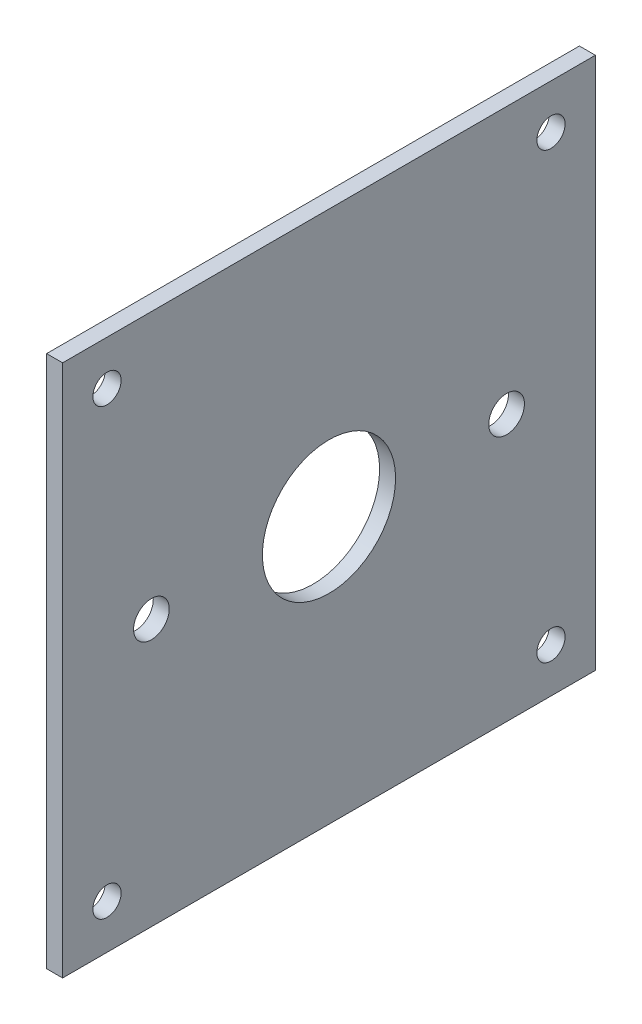
ISO-10303-21;
HEADER;
FILE_DESCRIPTION(('STEP AP214'),'2;1');
FILE_NAME('part.step','',(''),(''),'','','');
FILE_SCHEMA(('AUTOMOTIVE_DESIGN { 1 0 10303 214 1 1 1 1 }'));
ENDSEC;
DATA;
#1=APPLICATION_CONTEXT('core data for automotive mechanical design processes');
#2=APPLICATION_PROTOCOL_DEFINITION('international standard','automotive_design',2000,#1);
#3=PRODUCT_CONTEXT('',#1,'mechanical');
#4=PRODUCT('Part','Part','',(#3));
#5=PRODUCT_RELATED_PRODUCT_CATEGORY('part','',(#4));
#6=PRODUCT_DEFINITION_FORMATION('','',#4);
#7=PRODUCT_DEFINITION_CONTEXT('part definition',#1,'design');
#8=PRODUCT_DEFINITION('design','',#6,#7);
#9=PRODUCT_DEFINITION_SHAPE('','',#8);
#10=(LENGTH_UNIT() NAMED_UNIT(*) SI_UNIT(.MILLI.,.METRE.));
#11=(NAMED_UNIT(*) PLANE_ANGLE_UNIT() SI_UNIT($,.RADIAN.));
#12=(NAMED_UNIT(*) SI_UNIT($,.STERADIAN.) SOLID_ANGLE_UNIT());
#13=UNCERTAINTY_MEASURE_WITH_UNIT(LENGTH_MEASURE(1.E-05),#10,'distance_accuracy_value','');
#14=(GEOMETRIC_REPRESENTATION_CONTEXT(3) GLOBAL_UNCERTAINTY_ASSIGNED_CONTEXT((#13)) GLOBAL_UNIT_ASSIGNED_CONTEXT((#10,
#11,#12)) REPRESENTATION_CONTEXT('',''));
#15=CARTESIAN_POINT('',(0.,0.,0.));
#16=DIRECTION('',(0.,0.,1.));
#17=DIRECTION('',(1.,0.,0.));
#18=AXIS2_PLACEMENT_3D('',#15,#16,#17);
#19=CARTESIAN_POINT('',(2.286,0.,0.));
#20=DIRECTION('',(-1.,0.,0.));
#21=DIRECTION('',(0.,0.,1.));
#22=AXIS2_PLACEMENT_3D('',#19,#20,#21);
#23=PLANE('',#22);
#24=DIRECTION('',(0.,0.,1.));
#25=VECTOR('',#24,1.);
#26=CARTESIAN_POINT('',(2.286,38.1,38.1));
#27=LINE('',#26,#25);
#28=CARTESIAN_POINT('',(2.286,38.1,-38.1));
#29=VERTEX_POINT('',#28);
#30=CARTESIAN_POINT('',(2.286,38.1,38.1));
#31=VERTEX_POINT('',#30);
#32=EDGE_CURVE('E89',#29,#31,#27,.T.);
#33=ORIENTED_EDGE('',*,*,#32,.T.);
#34=DIRECTION('',(0.,-1.,0.));
#35=VECTOR('',#34,1.);
#36=CARTESIAN_POINT('',(2.286,-38.1,38.1));
#37=LINE('',#36,#35);
#38=CARTESIAN_POINT('',(2.286,-38.1,38.1));
#39=VERTEX_POINT('',#38);
#40=EDGE_CURVE('E84',#31,#39,#37,.T.);
#41=ORIENTED_EDGE('',*,*,#40,.T.);
#42=DIRECTION('',(0.,0.,-1.));
#43=VECTOR('',#42,1.);
#44=CARTESIAN_POINT('',(2.286,-38.1,-38.1));
#45=LINE('',#44,#43);
#46=CARTESIAN_POINT('',(2.286,-38.1,-38.1));
#47=VERTEX_POINT('',#46);
#48=EDGE_CURVE('E87',#39,#47,#45,.T.);
#49=ORIENTED_EDGE('',*,*,#48,.T.);
#50=DIRECTION('',(0.,1.,0.));
#51=VECTOR('',#50,1.);
#52=CARTESIAN_POINT('',(2.286,38.1,-38.1));
#53=LINE('',#52,#51);
#54=EDGE_CURVE('E54',#47,#29,#53,.T.);
#55=ORIENTED_EDGE('',*,*,#54,.T.);
#56=EDGE_LOOP('',(#33,#41,#49,#55));
#57=FACE_BOUND('',#56,.T.);
#58=CARTESIAN_POINT('',(2.286,0.,25.4));
#59=DIRECTION('',(1.,0.,0.));
#60=DIRECTION('',(0.,0.,-1.));
#61=AXIS2_PLACEMENT_3D('',#58,#59,#60);
#62=CIRCLE('',#61,2.5527);
#63=CARTESIAN_POINT('',(2.286,0.,22.8473));
#64=VERTEX_POINT('',#63);
#65=EDGE_CURVE('E104',#64,#64,#62,.T.);
#66=ORIENTED_EDGE('',*,*,#65,.F.);
#67=EDGE_LOOP('',(#66));
#68=FACE_BOUND('',#67,.T.);
#69=CARTESIAN_POINT('',(2.286,31.75,31.75));
#70=DIRECTION('',(1.,0.,0.));
#71=DIRECTION('',(0.,0.,-1.));
#72=AXIS2_PLACEMENT_3D('',#69,#70,#71);
#73=CIRCLE('',#72,2.0193);
#74=CARTESIAN_POINT('',(2.286,31.75,29.7307));
#75=VERTEX_POINT('',#74);
#76=EDGE_CURVE('E119',#75,#75,#73,.T.);
#77=ORIENTED_EDGE('',*,*,#76,.F.);
#78=EDGE_LOOP('',(#77));
#79=FACE_BOUND('',#78,.T.);
#80=CARTESIAN_POINT('',(2.286,0.,0.));
#81=DIRECTION('',(1.,0.,0.));
#82=DIRECTION('',(0.,0.,-1.));
#83=AXIS2_PLACEMENT_3D('',#80,#81,#82);
#84=CIRCLE('',#83,9.525);
#85=CARTESIAN_POINT('',(2.286,0.,-9.525));
#86=VERTEX_POINT('',#85);
#87=EDGE_CURVE('E125',#86,#86,#84,.T.);
#88=ORIENTED_EDGE('',*,*,#87,.F.);
#89=EDGE_LOOP('',(#88));
#90=FACE_BOUND('',#89,.T.);
#91=CARTESIAN_POINT('',(2.286,0.,-25.4));
#92=DIRECTION('',(1.,0.,0.));
#93=DIRECTION('',(0.,0.,-1.));
#94=AXIS2_PLACEMENT_3D('',#91,#92,#93);
#95=CIRCLE('',#94,2.5527);
#96=CARTESIAN_POINT('',(2.286,0.,-27.9527));
#97=VERTEX_POINT('',#96);
#98=EDGE_CURVE('E131',#97,#97,#95,.T.);
#99=ORIENTED_EDGE('',*,*,#98,.F.);
#100=EDGE_LOOP('',(#99));
#101=FACE_BOUND('',#100,.T.);
#102=CARTESIAN_POINT('',(2.286,31.75,-31.75));
#103=DIRECTION('',(1.,0.,0.));
#104=DIRECTION('',(0.,0.,-1.));
#105=AXIS2_PLACEMENT_3D('',#102,#103,#104);
#106=CIRCLE('',#105,2.0193);
#107=CARTESIAN_POINT('',(2.286,31.75,-33.7693));
#108=VERTEX_POINT('',#107);
#109=EDGE_CURVE('E137',#108,#108,#106,.T.);
#110=ORIENTED_EDGE('',*,*,#109,.F.);
#111=EDGE_LOOP('',(#110));
#112=FACE_BOUND('',#111,.T.);
#113=CARTESIAN_POINT('',(2.286,-31.75,-31.75));
#114=DIRECTION('',(1.,0.,0.));
#115=DIRECTION('',(0.,0.,-1.));
#116=AXIS2_PLACEMENT_3D('',#113,#114,#115);
#117=CIRCLE('',#116,2.0193);
#118=CARTESIAN_POINT('',(2.286,-31.75,-33.7693));
#119=VERTEX_POINT('',#118);
#120=EDGE_CURVE('E143',#119,#119,#117,.T.);
#121=ORIENTED_EDGE('',*,*,#120,.F.);
#122=EDGE_LOOP('',(#121));
#123=FACE_BOUND('',#122,.T.);
#124=CARTESIAN_POINT('',(2.286,-31.75,31.75));
#125=DIRECTION('',(1.,0.,0.));
#126=DIRECTION('',(0.,0.,-1.));
#127=AXIS2_PLACEMENT_3D('',#124,#125,#126);
#128=CIRCLE('',#127,2.0193);
#129=CARTESIAN_POINT('',(2.286,-31.75,29.7307));
#130=VERTEX_POINT('',#129);
#131=EDGE_CURVE('E149',#130,#130,#128,.T.);
#132=ORIENTED_EDGE('',*,*,#131,.F.);
#133=EDGE_LOOP('',(#132));
#134=FACE_BOUND('',#133,.T.);
#135=ADVANCED_FACE('F37',(#57,#68,#79,#90,#101,#112,#123,#134),#23,.F.);
#136=CARTESIAN_POINT('',(0.,0.,0.));
#137=DIRECTION('',(-1.,0.,0.));
#138=DIRECTION('',(0.,0.,1.));
#139=AXIS2_PLACEMENT_3D('',#136,#137,#138);
#140=PLANE('',#139);
#141=CARTESIAN_POINT('',(0.,-31.75,-31.75));
#142=DIRECTION('',(1.,0.,0.));
#143=DIRECTION('',(0.,0.,-1.));
#144=AXIS2_PLACEMENT_3D('',#141,#142,#143);
#145=CIRCLE('',#144,2.0193);
#146=CARTESIAN_POINT('',(0.,-31.75,-33.7693));
#147=VERTEX_POINT('',#146);
#148=EDGE_CURVE('E146',#147,#147,#145,.T.);
#149=ORIENTED_EDGE('',*,*,#148,.T.);
#150=EDGE_LOOP('',(#149));
#151=FACE_BOUND('',#150,.T.);
#152=CARTESIAN_POINT('',(0.,0.,-25.4));
#153=DIRECTION('',(1.,0.,0.));
#154=DIRECTION('',(0.,0.,-1.));
#155=AXIS2_PLACEMENT_3D('',#152,#153,#154);
#156=CIRCLE('',#155,2.5527);
#157=CARTESIAN_POINT('',(0.,0.,-27.9527));
#158=VERTEX_POINT('',#157);
#159=EDGE_CURVE('E134',#158,#158,#156,.T.);
#160=ORIENTED_EDGE('',*,*,#159,.T.);
#161=EDGE_LOOP('',(#160));
#162=FACE_BOUND('',#161,.T.);
#163=CARTESIAN_POINT('',(0.,31.75,31.75));
#164=DIRECTION('',(1.,0.,0.));
#165=DIRECTION('',(0.,0.,-1.));
#166=AXIS2_PLACEMENT_3D('',#163,#164,#165);
#167=CIRCLE('',#166,2.0193);
#168=CARTESIAN_POINT('',(0.,31.75,29.7307));
#169=VERTEX_POINT('',#168);
#170=EDGE_CURVE('E122',#169,#169,#167,.T.);
#171=ORIENTED_EDGE('',*,*,#170,.T.);
#172=EDGE_LOOP('',(#171));
#173=FACE_BOUND('',#172,.T.);
#174=DIRECTION('',(0.,0.,1.));
#175=VECTOR('',#174,1.);
#176=CARTESIAN_POINT('',(0.,38.1,38.1));
#177=LINE('',#176,#175);
#178=CARTESIAN_POINT('',(0.,38.1,-38.1));
#179=VERTEX_POINT('',#178);
#180=CARTESIAN_POINT('',(0.,38.1,38.1));
#181=VERTEX_POINT('',#180);
#182=EDGE_CURVE('E101',#179,#181,#177,.T.);
#183=ORIENTED_EDGE('',*,*,#182,.F.);
#184=DIRECTION('',(0.,1.,0.));
#185=VECTOR('',#184,1.);
#186=CARTESIAN_POINT('',(0.,38.1,-38.1));
#187=LINE('',#186,#185);
#188=CARTESIAN_POINT('',(0.,-38.1,-38.1));
#189=VERTEX_POINT('',#188);
#190=EDGE_CURVE('E77',#189,#179,#187,.T.);
#191=ORIENTED_EDGE('',*,*,#190,.F.);
#192=DIRECTION('',(0.,0.,-1.));
#193=VECTOR('',#192,1.);
#194=CARTESIAN_POINT('',(0.,-38.1,-38.1));
#195=LINE('',#194,#193);
#196=CARTESIAN_POINT('',(0.,-38.1,38.1));
#197=VERTEX_POINT('',#196);
#198=EDGE_CURVE('E71',#197,#189,#195,.T.);
#199=ORIENTED_EDGE('',*,*,#198,.F.);
#200=DIRECTION('',(0.,-1.,0.));
#201=VECTOR('',#200,1.);
#202=CARTESIAN_POINT('',(0.,-38.1,38.1));
#203=LINE('',#202,#201);
#204=EDGE_CURVE('E93',#181,#197,#203,.T.);
#205=ORIENTED_EDGE('',*,*,#204,.F.);
#206=EDGE_LOOP('',(#183,#191,#199,#205));
#207=FACE_BOUND('',#206,.T.);
#208=CARTESIAN_POINT('',(0.,0.,25.4));
#209=DIRECTION('',(1.,0.,0.));
#210=DIRECTION('',(0.,0.,-1.));
#211=AXIS2_PLACEMENT_3D('',#208,#209,#210);
#212=CIRCLE('',#211,2.5527);
#213=CARTESIAN_POINT('',(0.,0.,22.8473));
#214=VERTEX_POINT('',#213);
#215=EDGE_CURVE('E116',#214,#214,#212,.T.);
#216=ORIENTED_EDGE('',*,*,#215,.T.);
#217=EDGE_LOOP('',(#216));
#218=FACE_BOUND('',#217,.T.);
#219=CARTESIAN_POINT('',(0.,0.,0.));
#220=DIRECTION('',(1.,0.,0.));
#221=DIRECTION('',(0.,0.,-1.));
#222=AXIS2_PLACEMENT_3D('',#219,#220,#221);
#223=CIRCLE('',#222,9.525);
#224=CARTESIAN_POINT('',(0.,0.,-9.525));
#225=VERTEX_POINT('',#224);
#226=EDGE_CURVE('E128',#225,#225,#223,.T.);
#227=ORIENTED_EDGE('',*,*,#226,.T.);
#228=EDGE_LOOP('',(#227));
#229=FACE_BOUND('',#228,.T.);
#230=CARTESIAN_POINT('',(0.,31.75,-31.75));
#231=DIRECTION('',(1.,0.,0.));
#232=DIRECTION('',(0.,0.,-1.));
#233=AXIS2_PLACEMENT_3D('',#230,#231,#232);
#234=CIRCLE('',#233,2.0193);
#235=CARTESIAN_POINT('',(0.,31.75,-33.7693));
#236=VERTEX_POINT('',#235);
#237=EDGE_CURVE('E140',#236,#236,#234,.T.);
#238=ORIENTED_EDGE('',*,*,#237,.T.);
#239=EDGE_LOOP('',(#238));
#240=FACE_BOUND('',#239,.T.);
#241=CARTESIAN_POINT('',(0.,-31.75,31.75));
#242=DIRECTION('',(1.,0.,0.));
#243=DIRECTION('',(0.,0.,-1.));
#244=AXIS2_PLACEMENT_3D('',#241,#242,#243);
#245=CIRCLE('',#244,2.0193);
#246=CARTESIAN_POINT('',(0.,-31.75,29.7307));
#247=VERTEX_POINT('',#246);
#248=EDGE_CURVE('E152',#247,#247,#245,.T.);
#249=ORIENTED_EDGE('',*,*,#248,.T.);
#250=EDGE_LOOP('',(#249));
#251=FACE_BOUND('',#250,.T.);
#252=ADVANCED_FACE('F112',(#151,#162,#173,#207,#218,#229,#240,#251),#140,.T.);
#253=CARTESIAN_POINT('',(2.286,38.1,38.1));
#254=DIRECTION('',(0.,-1.,0.));
#255=DIRECTION('',(0.,0.,-1.));
#256=AXIS2_PLACEMENT_3D('',#253,#254,#255);
#257=PLANE('',#256);
#258=ORIENTED_EDGE('',*,*,#182,.T.);
#259=DIRECTION('',(-1.,0.,0.));
#260=VECTOR('',#259,1.);
#261=CARTESIAN_POINT('',(2.286,38.1,38.1));
#262=LINE('',#261,#260);
#263=EDGE_CURVE('E11',#31,#181,#262,.T.);
#264=ORIENTED_EDGE('',*,*,#263,.F.);
#265=ORIENTED_EDGE('',*,*,#32,.F.);
#266=DIRECTION('',(-1.,0.,0.));
#267=VECTOR('',#266,1.);
#268=CARTESIAN_POINT('',(2.286,38.1,-38.1));
#269=LINE('',#268,#267);
#270=EDGE_CURVE('E97',#29,#179,#269,.T.);
#271=ORIENTED_EDGE('',*,*,#270,.T.);
#272=EDGE_LOOP('',(#258,#264,#265,#271));
#273=FACE_BOUND('',#272,.T.);
#274=ADVANCED_FACE('F39',(#273),#257,.F.);
#275=CARTESIAN_POINT('',(2.286,-38.1,38.1));
#276=DIRECTION('',(0.,0.,-1.));
#277=DIRECTION('',(-1.,0.,0.));
#278=AXIS2_PLACEMENT_3D('',#275,#276,#277);
#279=PLANE('',#278);
#280=ORIENTED_EDGE('',*,*,#204,.T.);
#281=DIRECTION('',(-1.,0.,0.));
#282=VECTOR('',#281,1.);
#283=CARTESIAN_POINT('',(2.286,-38.1,38.1));
#284=LINE('',#283,#282);
#285=EDGE_CURVE('E46',#39,#197,#284,.T.);
#286=ORIENTED_EDGE('',*,*,#285,.F.);
#287=ORIENTED_EDGE('',*,*,#40,.F.);
#288=ORIENTED_EDGE('',*,*,#263,.T.);
#289=EDGE_LOOP('',(#280,#286,#287,#288));
#290=FACE_BOUND('',#289,.T.);
#291=ADVANCED_FACE('F92',(#290),#279,.F.);
#292=CARTESIAN_POINT('',(2.286,-38.1,-38.1));
#293=DIRECTION('',(0.,1.,0.));
#294=DIRECTION('',(0.,0.,1.));
#295=AXIS2_PLACEMENT_3D('',#292,#293,#294);
#296=PLANE('',#295);
#297=ORIENTED_EDGE('',*,*,#198,.T.);
#298=DIRECTION('',(-1.,0.,0.));
#299=VECTOR('',#298,1.);
#300=CARTESIAN_POINT('',(2.286,-38.1,-38.1));
#301=LINE('',#300,#299);
#302=EDGE_CURVE('E94',#47,#189,#301,.T.);
#303=ORIENTED_EDGE('',*,*,#302,.F.);
#304=ORIENTED_EDGE('',*,*,#48,.F.);
#305=ORIENTED_EDGE('',*,*,#285,.T.);
#306=EDGE_LOOP('',(#297,#303,#304,#305));
#307=FACE_BOUND('',#306,.T.);
#308=ADVANCED_FACE('F95',(#307),#296,.F.);
#309=CARTESIAN_POINT('',(2.286,38.1,-38.1));
#310=DIRECTION('',(0.,0.,1.));
#311=DIRECTION('',(1.,0.,0.));
#312=AXIS2_PLACEMENT_3D('',#309,#310,#311);
#313=PLANE('',#312);
#314=ORIENTED_EDGE('',*,*,#190,.T.);
#315=ORIENTED_EDGE('',*,*,#270,.F.);
#316=ORIENTED_EDGE('',*,*,#54,.F.);
#317=ORIENTED_EDGE('',*,*,#302,.T.);
#318=EDGE_LOOP('',(#314,#315,#316,#317));
#319=FACE_BOUND('',#318,.T.);
#320=ADVANCED_FACE('F109',(#319),#313,.F.);
#321=CARTESIAN_POINT('',(2.286,0.,25.4));
#322=DIRECTION('',(-1.,0.,0.));
#323=DIRECTION('',(0.,0.,1.));
#324=AXIS2_PLACEMENT_3D('',#321,#322,#323);
#325=CYLINDRICAL_SURFACE('',#324,2.5527);
#326=ORIENTED_EDGE('',*,*,#65,.T.);
#327=EDGE_LOOP('',(#326));
#328=FACE_BOUND('',#327,.T.);
#329=ORIENTED_EDGE('',*,*,#215,.F.);
#330=EDGE_LOOP('',(#329));
#331=FACE_BOUND('',#330,.T.);
#332=ADVANCED_FACE('F169',(#328,#331),#325,.F.);
#333=CARTESIAN_POINT('',(2.286,31.75,31.75));
#334=DIRECTION('',(-1.,0.,0.));
#335=DIRECTION('',(0.,0.,1.));
#336=AXIS2_PLACEMENT_3D('',#333,#334,#335);
#337=CYLINDRICAL_SURFACE('',#336,2.0193);
#338=ORIENTED_EDGE('',*,*,#76,.T.);
#339=EDGE_LOOP('',(#338));
#340=FACE_BOUND('',#339,.T.);
#341=ORIENTED_EDGE('',*,*,#170,.F.);
#342=EDGE_LOOP('',(#341));
#343=FACE_BOUND('',#342,.T.);
#344=ADVANCED_FACE('F215',(#340,#343),#337,.F.);
#345=CARTESIAN_POINT('',(2.286,0.,0.));
#346=DIRECTION('',(-1.,0.,0.));
#347=DIRECTION('',(0.,0.,1.));
#348=AXIS2_PLACEMENT_3D('',#345,#346,#347);
#349=CYLINDRICAL_SURFACE('',#348,9.525);
#350=ORIENTED_EDGE('',*,*,#87,.T.);
#351=EDGE_LOOP('',(#350));
#352=FACE_BOUND('',#351,.T.);
#353=ORIENTED_EDGE('',*,*,#226,.F.);
#354=EDGE_LOOP('',(#353));
#355=FACE_BOUND('',#354,.T.);
#356=ADVANCED_FACE('F223',(#352,#355),#349,.F.);
#357=CARTESIAN_POINT('',(2.286,0.,-25.4));
#358=DIRECTION('',(-1.,0.,0.));
#359=DIRECTION('',(0.,0.,1.));
#360=AXIS2_PLACEMENT_3D('',#357,#358,#359);
#361=CYLINDRICAL_SURFACE('',#360,2.5527);
#362=ORIENTED_EDGE('',*,*,#98,.T.);
#363=EDGE_LOOP('',(#362));
#364=FACE_BOUND('',#363,.T.);
#365=ORIENTED_EDGE('',*,*,#159,.F.);
#366=EDGE_LOOP('',(#365));
#367=FACE_BOUND('',#366,.T.);
#368=ADVANCED_FACE('F231',(#364,#367),#361,.F.);
#369=CARTESIAN_POINT('',(2.286,31.75,-31.75));
#370=DIRECTION('',(-1.,0.,0.));
#371=DIRECTION('',(0.,0.,1.));
#372=AXIS2_PLACEMENT_3D('',#369,#370,#371);
#373=CYLINDRICAL_SURFACE('',#372,2.0193);
#374=ORIENTED_EDGE('',*,*,#109,.T.);
#375=EDGE_LOOP('',(#374));
#376=FACE_BOUND('',#375,.T.);
#377=ORIENTED_EDGE('',*,*,#237,.F.);
#378=EDGE_LOOP('',(#377));
#379=FACE_BOUND('',#378,.T.);
#380=ADVANCED_FACE('F240',(#376,#379),#373,.F.);
#381=CARTESIAN_POINT('',(2.286,-31.75,-31.75));
#382=DIRECTION('',(-1.,0.,0.));
#383=DIRECTION('',(0.,0.,1.));
#384=AXIS2_PLACEMENT_3D('',#381,#382,#383);
#385=CYLINDRICAL_SURFACE('',#384,2.0193);
#386=ORIENTED_EDGE('',*,*,#120,.T.);
#387=EDGE_LOOP('',(#386));
#388=FACE_BOUND('',#387,.T.);
#389=ORIENTED_EDGE('',*,*,#148,.F.);
#390=EDGE_LOOP('',(#389));
#391=FACE_BOUND('',#390,.T.);
#392=ADVANCED_FACE('F249',(#388,#391),#385,.F.);
#393=CARTESIAN_POINT('',(2.286,-31.75,31.75));
#394=DIRECTION('',(-1.,0.,0.));
#395=DIRECTION('',(0.,0.,1.));
#396=AXIS2_PLACEMENT_3D('',#393,#394,#395);
#397=CYLINDRICAL_SURFACE('',#396,2.0193);
#398=ORIENTED_EDGE('',*,*,#131,.T.);
#399=EDGE_LOOP('',(#398));
#400=FACE_BOUND('',#399,.T.);
#401=ORIENTED_EDGE('',*,*,#248,.F.);
#402=EDGE_LOOP('',(#401));
#403=FACE_BOUND('',#402,.T.);
#404=ADVANCED_FACE('F158',(#400,#403),#397,.F.);
#405=CLOSED_SHELL('',(#135,#252,#274,#291,#308,#320,#332,#344,#356,#368,#380,#392,#404));
#406=MANIFOLD_SOLID_BREP('B2',#405);
#407=ADVANCED_BREP_SHAPE_REPRESENTATION('',(#18,#406),#14);
#408=SHAPE_DEFINITION_REPRESENTATION(#9,#407);
ENDSEC;
END-ISO-10303-21;
